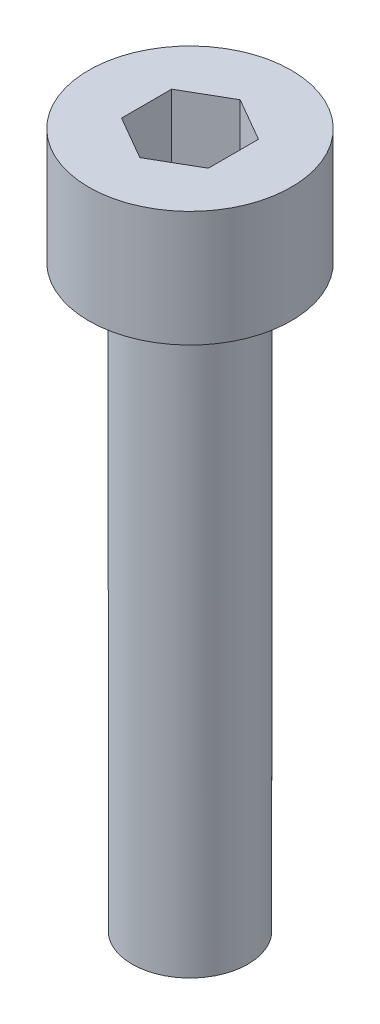
ISO-10303-21;
HEADER;
FILE_DESCRIPTION(('STEP AP214'),'2;1');
FILE_NAME('part.step','',(''),(''),'','','');
FILE_SCHEMA(('AUTOMOTIVE_DESIGN { 1 0 10303 214 1 1 1 1 }'));
ENDSEC;
DATA;
#1=APPLICATION_CONTEXT('core data for automotive mechanical design processes');
#2=APPLICATION_PROTOCOL_DEFINITION('international standard','automotive_design',2000,#1);
#3=PRODUCT_CONTEXT('',#1,'mechanical');
#4=PRODUCT('Part','Part','',(#3));
#5=PRODUCT_RELATED_PRODUCT_CATEGORY('part','',(#4));
#6=PRODUCT_DEFINITION_FORMATION('','',#4);
#7=PRODUCT_DEFINITION_CONTEXT('part definition',#1,'design');
#8=PRODUCT_DEFINITION('design','',#6,#7);
#9=PRODUCT_DEFINITION_SHAPE('','',#8);
#10=(LENGTH_UNIT() NAMED_UNIT(*) SI_UNIT(.MILLI.,.METRE.));
#11=(NAMED_UNIT(*) PLANE_ANGLE_UNIT() SI_UNIT($,.RADIAN.));
#12=(NAMED_UNIT(*) SI_UNIT($,.STERADIAN.) SOLID_ANGLE_UNIT());
#13=UNCERTAINTY_MEASURE_WITH_UNIT(LENGTH_MEASURE(1.E-05),#10,'distance_accuracy_value','');
#14=(GEOMETRIC_REPRESENTATION_CONTEXT(3) GLOBAL_UNCERTAINTY_ASSIGNED_CONTEXT((#13)) GLOBAL_UNIT_ASSIGNED_CONTEXT((#10,
#11,#12)) REPRESENTATION_CONTEXT('',''));
#15=CARTESIAN_POINT('',(0.,0.,0.));
#16=DIRECTION('',(0.,0.,1.));
#17=DIRECTION('',(1.,0.,0.));
#18=AXIS2_PLACEMENT_3D('',#15,#16,#17);
#19=CARTESIAN_POINT('',(0.,4.,0.));
#20=DIRECTION('',(0.,1.,0.));
#21=DIRECTION('',(0.,0.,1.));
#22=AXIS2_PLACEMENT_3D('',#19,#20,#21);
#23=PLANE('',#22);
#24=CARTESIAN_POINT('',(0.,4.,0.));
#25=DIRECTION('',(0.,1.,0.));
#26=DIRECTION('',(0.,0.,1.));
#27=AXIS2_PLACEMENT_3D('',#24,#25,#26);
#28=CIRCLE('',#27,3.5);
#29=CARTESIAN_POINT('',(0.,4.,3.5));
#30=VERTEX_POINT('',#29);
#31=EDGE_CURVE('E41',#30,#30,#28,.T.);
#32=ORIENTED_EDGE('',*,*,#31,.T.);
#33=EDGE_LOOP('',(#32));
#34=FACE_BOUND('',#33,.T.);
#35=DIRECTION('',(-0.866025403784439,0.,0.5));
#36=VECTOR('',#35,1.);
#37=CARTESIAN_POINT('',(0.,4.,-1.73205080756888));
#38=LINE('',#37,#36);
#39=CARTESIAN_POINT('',(0.,4.,-1.73205080756888));
#40=VERTEX_POINT('',#39);
#41=CARTESIAN_POINT('',(-1.5,4.,-0.866025403784439));
#42=VERTEX_POINT('',#41);
#43=EDGE_CURVE('E103',#40,#42,#38,.T.);
#44=ORIENTED_EDGE('',*,*,#43,.F.);
#45=DIRECTION('',(-0.866025403784439,0.,-0.5));
#46=VECTOR('',#45,1.);
#47=CARTESIAN_POINT('',(1.5,4.,-0.866025403784439));
#48=LINE('',#47,#46);
#49=CARTESIAN_POINT('',(1.5,4.,-0.866025403784439));
#50=VERTEX_POINT('',#49);
#51=EDGE_CURVE('E83',#50,#40,#48,.T.);
#52=ORIENTED_EDGE('',*,*,#51,.F.);
#53=DIRECTION('',(0.,0.,-1.));
#54=VECTOR('',#53,1.);
#55=CARTESIAN_POINT('',(1.5,4.,0.866025403784439));
#56=LINE('',#55,#54);
#57=CARTESIAN_POINT('',(1.5,4.,0.866025403784439));
#58=VERTEX_POINT('',#57);
#59=EDGE_CURVE('E54',#58,#50,#56,.T.);
#60=ORIENTED_EDGE('',*,*,#59,.F.);
#61=DIRECTION('',(0.866025403784439,0.,-0.5));
#62=VECTOR('',#61,1.);
#63=CARTESIAN_POINT('',(0.,4.,1.73205080756888));
#64=LINE('',#63,#62);
#65=CARTESIAN_POINT('',(0.,4.,1.73205080756888));
#66=VERTEX_POINT('',#65);
#67=EDGE_CURVE('E114',#66,#58,#64,.T.);
#68=ORIENTED_EDGE('',*,*,#67,.F.);
#69=DIRECTION('',(0.866025403784439,0.,0.5));
#70=VECTOR('',#69,1.);
#71=CARTESIAN_POINT('',(-1.5,4.,0.866025403784439));
#72=LINE('',#71,#70);
#73=CARTESIAN_POINT('',(-1.5,4.,0.866025403784439));
#74=VERTEX_POINT('',#73);
#75=EDGE_CURVE('E102',#74,#66,#72,.T.);
#76=ORIENTED_EDGE('',*,*,#75,.F.);
#77=DIRECTION('',(0.,0.,1.));
#78=VECTOR('',#77,1.);
#79=CARTESIAN_POINT('',(-1.5,4.,-0.866025403784439));
#80=LINE('',#79,#78);
#81=EDGE_CURVE('E92',#42,#74,#80,.T.);
#82=ORIENTED_EDGE('',*,*,#81,.F.);
#83=EDGE_LOOP('',(#44,#52,#60,#68,#76,#82));
#84=FACE_BOUND('',#83,.T.);
#85=ADVANCED_FACE('F33',(#34,#84),#23,.T.);
#86=CARTESIAN_POINT('',(0.,0.,0.));
#87=DIRECTION('',(0.,1.,0.));
#88=DIRECTION('',(0.,0.,1.));
#89=AXIS2_PLACEMENT_3D('',#86,#87,#88);
#90=PLANE('',#89);
#91=CARTESIAN_POINT('',(0.,0.,0.));
#92=DIRECTION('',(0.,1.,0.));
#93=DIRECTION('',(0.,0.,1.));
#94=AXIS2_PLACEMENT_3D('',#91,#92,#93);
#95=CIRCLE('',#94,2.);
#96=CARTESIAN_POINT('',(0.,0.,2.));
#97=VERTEX_POINT('',#96);
#98=EDGE_CURVE('E11',#97,#97,#95,.F.);
#99=ORIENTED_EDGE('',*,*,#98,.F.);
#100=EDGE_LOOP('',(#99));
#101=FACE_BOUND('',#100,.T.);
#102=CARTESIAN_POINT('',(0.,0.,0.));
#103=DIRECTION('',(0.,1.,0.));
#104=DIRECTION('',(0.,0.,1.));
#105=AXIS2_PLACEMENT_3D('',#102,#103,#104);
#106=CIRCLE('',#105,3.5);
#107=CARTESIAN_POINT('',(0.,0.,3.5));
#108=VERTEX_POINT('',#107);
#109=EDGE_CURVE('E143',#108,#108,#106,.T.);
#110=ORIENTED_EDGE('',*,*,#109,.F.);
#111=EDGE_LOOP('',(#110));
#112=FACE_BOUND('',#111,.T.);
#113=ADVANCED_FACE('F149',(#101,#112),#90,.F.);
#114=CARTESIAN_POINT('',(0.,4.,0.));
#115=DIRECTION('',(0.,-1.,0.));
#116=DIRECTION('',(0.,0.,-1.));
#117=AXIS2_PLACEMENT_3D('',#114,#115,#116);
#118=CYLINDRICAL_SURFACE('',#117,3.5);
#119=ORIENTED_EDGE('',*,*,#31,.F.);
#120=EDGE_LOOP('',(#119));
#121=FACE_BOUND('',#120,.T.);
#122=ORIENTED_EDGE('',*,*,#109,.T.);
#123=EDGE_LOOP('',(#122));
#124=FACE_BOUND('',#123,.T.);
#125=ADVANCED_FACE('F35',(#121,#124),#118,.T.);
#126=CARTESIAN_POINT('',(1.5,4.,-0.866025403784439));
#127=DIRECTION('',(-0.5,0.,0.866025403784439));
#128=DIRECTION('',(0.866025403784439,0.,0.5));
#129=AXIS2_PLACEMENT_3D('',#126,#127,#128);
#130=PLANE('',#129);
#131=DIRECTION('',(-0.866025403784439,0.,-0.5));
#132=VECTOR('',#131,1.);
#133=CARTESIAN_POINT('',(1.5,0.,-0.866025403784439));
#134=LINE('',#133,#132);
#135=CARTESIAN_POINT('',(1.5,0.,-0.86602540378444));
#136=VERTEX_POINT('',#135);
#137=CARTESIAN_POINT('',(0.,0.,-1.73205080756888));
#138=VERTEX_POINT('',#137);
#139=EDGE_CURVE('E121',#136,#138,#134,.T.);
#140=ORIENTED_EDGE('',*,*,#139,.F.);
#141=DIRECTION('',(0.,-1.,0.));
#142=VECTOR('',#141,1.);
#143=CARTESIAN_POINT('',(1.5,4.,-0.866025403784439));
#144=LINE('',#143,#142);
#145=EDGE_CURVE('E120',#50,#136,#144,.T.);
#146=ORIENTED_EDGE('',*,*,#145,.F.);
#147=ORIENTED_EDGE('',*,*,#51,.T.);
#148=DIRECTION('',(0.,-1.,0.));
#149=VECTOR('',#148,1.);
#150=CARTESIAN_POINT('',(0.,4.,-1.73205080756888));
#151=LINE('',#150,#149);
#152=EDGE_CURVE('E141',#40,#138,#151,.T.);
#153=ORIENTED_EDGE('',*,*,#152,.T.);
#154=EDGE_LOOP('',(#140,#146,#147,#153));
#155=FACE_BOUND('',#154,.T.);
#156=ADVANCED_FACE('F156',(#155),#130,.T.);
#157=CARTESIAN_POINT('',(0.,4.,-1.73205080756888));
#158=DIRECTION('',(0.5,0.,0.866025403784439));
#159=DIRECTION('',(0.866025403784439,0.,-0.5));
#160=AXIS2_PLACEMENT_3D('',#157,#158,#159);
#161=PLANE('',#160);
#162=DIRECTION('',(-0.866025403784439,0.,0.5));
#163=VECTOR('',#162,1.);
#164=CARTESIAN_POINT('',(0.,0.,-1.73205080756888));
#165=LINE('',#164,#163);
#166=CARTESIAN_POINT('',(-1.5,0.,-0.866025403784439));
#167=VERTEX_POINT('',#166);
#168=EDGE_CURVE('E124',#138,#167,#165,.T.);
#169=ORIENTED_EDGE('',*,*,#168,.F.);
#170=ORIENTED_EDGE('',*,*,#152,.F.);
#171=ORIENTED_EDGE('',*,*,#43,.T.);
#172=DIRECTION('',(0.,-1.,0.));
#173=VECTOR('',#172,1.);
#174=CARTESIAN_POINT('',(-1.5,4.,-0.866025403784439));
#175=LINE('',#174,#173);
#176=EDGE_CURVE('E98',#42,#167,#175,.T.);
#177=ORIENTED_EDGE('',*,*,#176,.T.);
#178=EDGE_LOOP('',(#169,#170,#171,#177));
#179=FACE_BOUND('',#178,.T.);
#180=ADVANCED_FACE('F164',(#179),#161,.T.);
#181=CARTESIAN_POINT('',(-1.5,4.,-0.866025403784439));
#182=DIRECTION('',(1.,0.,0.));
#183=DIRECTION('',(0.,0.,-1.));
#184=AXIS2_PLACEMENT_3D('',#181,#182,#183);
#185=PLANE('',#184);
#186=DIRECTION('',(0.,0.,1.));
#187=VECTOR('',#186,1.);
#188=CARTESIAN_POINT('',(-1.5,0.,-0.866025403784439));
#189=LINE('',#188,#187);
#190=CARTESIAN_POINT('',(-1.5,0.,0.866025403784439));
#191=VERTEX_POINT('',#190);
#192=EDGE_CURVE('E128',#167,#191,#189,.T.);
#193=ORIENTED_EDGE('',*,*,#192,.F.);
#194=ORIENTED_EDGE('',*,*,#176,.F.);
#195=ORIENTED_EDGE('',*,*,#81,.T.);
#196=DIRECTION('',(0.,-1.,0.));
#197=VECTOR('',#196,1.);
#198=CARTESIAN_POINT('',(-1.5,4.,0.866025403784439));
#199=LINE('',#198,#197);
#200=EDGE_CURVE('E96',#74,#191,#199,.T.);
#201=ORIENTED_EDGE('',*,*,#200,.T.);
#202=EDGE_LOOP('',(#193,#194,#195,#201));
#203=FACE_BOUND('',#202,.T.);
#204=ADVANCED_FACE('F95',(#203),#185,.T.);
#205=CARTESIAN_POINT('',(-1.5,4.,0.866025403784439));
#206=DIRECTION('',(0.5,0.,-0.866025403784439));
#207=DIRECTION('',(-0.866025403784439,0.,-0.5));
#208=AXIS2_PLACEMENT_3D('',#205,#206,#207);
#209=PLANE('',#208);
#210=DIRECTION('',(0.866025403784439,0.,0.5));
#211=VECTOR('',#210,1.);
#212=CARTESIAN_POINT('',(-1.5,0.,0.866025403784439));
#213=LINE('',#212,#211);
#214=CARTESIAN_POINT('',(0.,0.,1.73205080756888));
#215=VERTEX_POINT('',#214);
#216=EDGE_CURVE('E109',#191,#215,#213,.T.);
#217=ORIENTED_EDGE('',*,*,#216,.F.);
#218=ORIENTED_EDGE('',*,*,#200,.F.);
#219=ORIENTED_EDGE('',*,*,#75,.T.);
#220=DIRECTION('',(0.,-1.,0.));
#221=VECTOR('',#220,1.);
#222=CARTESIAN_POINT('',(0.,4.,1.73205080756888));
#223=LINE('',#222,#221);
#224=EDGE_CURVE('E111',#66,#215,#223,.T.);
#225=ORIENTED_EDGE('',*,*,#224,.T.);
#226=EDGE_LOOP('',(#217,#218,#219,#225));
#227=FACE_BOUND('',#226,.T.);
#228=ADVANCED_FACE('F106',(#227),#209,.T.);
#229=CARTESIAN_POINT('',(0.,4.,1.73205080756888));
#230=DIRECTION('',(-0.5,0.,-0.866025403784439));
#231=DIRECTION('',(-0.866025403784439,0.,0.5));
#232=AXIS2_PLACEMENT_3D('',#229,#230,#231);
#233=PLANE('',#232);
#234=DIRECTION('',(0.866025403784439,0.,-0.5));
#235=VECTOR('',#234,1.);
#236=CARTESIAN_POINT('',(0.,0.,1.73205080756888));
#237=LINE('',#236,#235);
#238=CARTESIAN_POINT('',(1.5,0.,0.866025403784439));
#239=VERTEX_POINT('',#238);
#240=EDGE_CURVE('E131',#215,#239,#237,.T.);
#241=ORIENTED_EDGE('',*,*,#240,.F.);
#242=ORIENTED_EDGE('',*,*,#224,.F.);
#243=ORIENTED_EDGE('',*,*,#67,.T.);
#244=DIRECTION('',(0.,-1.,0.));
#245=VECTOR('',#244,1.);
#246=CARTESIAN_POINT('',(1.5,4.,0.866025403784439));
#247=LINE('',#246,#245);
#248=EDGE_CURVE('E48',#58,#239,#247,.T.);
#249=ORIENTED_EDGE('',*,*,#248,.T.);
#250=EDGE_LOOP('',(#241,#242,#243,#249));
#251=FACE_BOUND('',#250,.T.);
#252=ADVANCED_FACE('F172',(#251),#233,.T.);
#253=CARTESIAN_POINT('',(1.5,4.,0.866025403784439));
#254=DIRECTION('',(-1.,0.,0.));
#255=DIRECTION('',(0.,0.,1.));
#256=AXIS2_PLACEMENT_3D('',#253,#254,#255);
#257=PLANE('',#256);
#258=DIRECTION('',(0.,0.,-1.));
#259=VECTOR('',#258,1.);
#260=CARTESIAN_POINT('',(1.5,0.,0.866025403784439));
#261=LINE('',#260,#259);
#262=EDGE_CURVE('E134',#239,#136,#261,.T.);
#263=ORIENTED_EDGE('',*,*,#262,.F.);
#264=ORIENTED_EDGE('',*,*,#248,.F.);
#265=ORIENTED_EDGE('',*,*,#59,.T.);
#266=ORIENTED_EDGE('',*,*,#145,.T.);
#267=EDGE_LOOP('',(#263,#264,#265,#266));
#268=FACE_BOUND('',#267,.T.);
#269=ADVANCED_FACE('F175',(#268),#257,.T.);
#270=CARTESIAN_POINT('',(0.,0.,0.));
#271=DIRECTION('',(0.,-1.,0.));
#272=DIRECTION('',(0.,0.,-1.));
#273=AXIS2_PLACEMENT_3D('',#270,#271,#272);
#274=PLANE('',#273);
#275=ORIENTED_EDGE('',*,*,#139,.T.);
#276=ORIENTED_EDGE('',*,*,#168,.T.);
#277=ORIENTED_EDGE('',*,*,#192,.T.);
#278=ORIENTED_EDGE('',*,*,#216,.T.);
#279=ORIENTED_EDGE('',*,*,#240,.T.);
#280=ORIENTED_EDGE('',*,*,#262,.T.);
#281=EDGE_LOOP('',(#275,#276,#277,#278,#279,#280));
#282=FACE_BOUND('',#281,.T.);
#283=ADVANCED_FACE('F178',(#282),#274,.F.);
#284=CARTESIAN_POINT('',(0.,-20.,0.));
#285=DIRECTION('',(0.,1.,0.));
#286=DIRECTION('',(0.,0.,1.));
#287=AXIS2_PLACEMENT_3D('',#284,#285,#286);
#288=CYLINDRICAL_SURFACE('',#287,2.);
#289=CARTESIAN_POINT('',(0.,-20.,0.));
#290=DIRECTION('',(0.,-1.,0.));
#291=DIRECTION('',(0.,0.,-1.));
#292=AXIS2_PLACEMENT_3D('',#289,#290,#291);
#293=CIRCLE('',#292,2.);
#294=CARTESIAN_POINT('',(0.,-20.,-2.));
#295=VERTEX_POINT('',#294);
#296=EDGE_CURVE('E125',#295,#295,#293,.T.);
#297=ORIENTED_EDGE('',*,*,#296,.F.);
#298=EDGE_LOOP('',(#297));
#299=FACE_BOUND('',#298,.T.);
#300=ORIENTED_EDGE('',*,*,#98,.T.);
#301=EDGE_LOOP('',(#300));
#302=FACE_BOUND('',#301,.T.);
#303=ADVANCED_FACE('F179',(#299,#302),#288,.T.);
#304=CARTESIAN_POINT('',(0.,-20.,0.));
#305=DIRECTION('',(0.,-1.,0.));
#306=DIRECTION('',(0.,0.,-1.));
#307=AXIS2_PLACEMENT_3D('',#304,#305,#306);
#308=PLANE('',#307);
#309=ORIENTED_EDGE('',*,*,#296,.T.);
#310=EDGE_LOOP('',(#309));
#311=FACE_BOUND('',#310,.T.);
#312=ADVANCED_FACE('F182',(#311),#308,.T.);
#313=CLOSED_SHELL('',(#85,#113,#125,#156,#180,#204,#228,#252,#269,#283,#303,#312));
#314=MANIFOLD_SOLID_BREP('B2',#313);
#315=ADVANCED_BREP_SHAPE_REPRESENTATION('',(#18,#314),#14);
#316=SHAPE_DEFINITION_REPRESENTATION(#9,#315);
ENDSEC;
END-ISO-10303-21;
